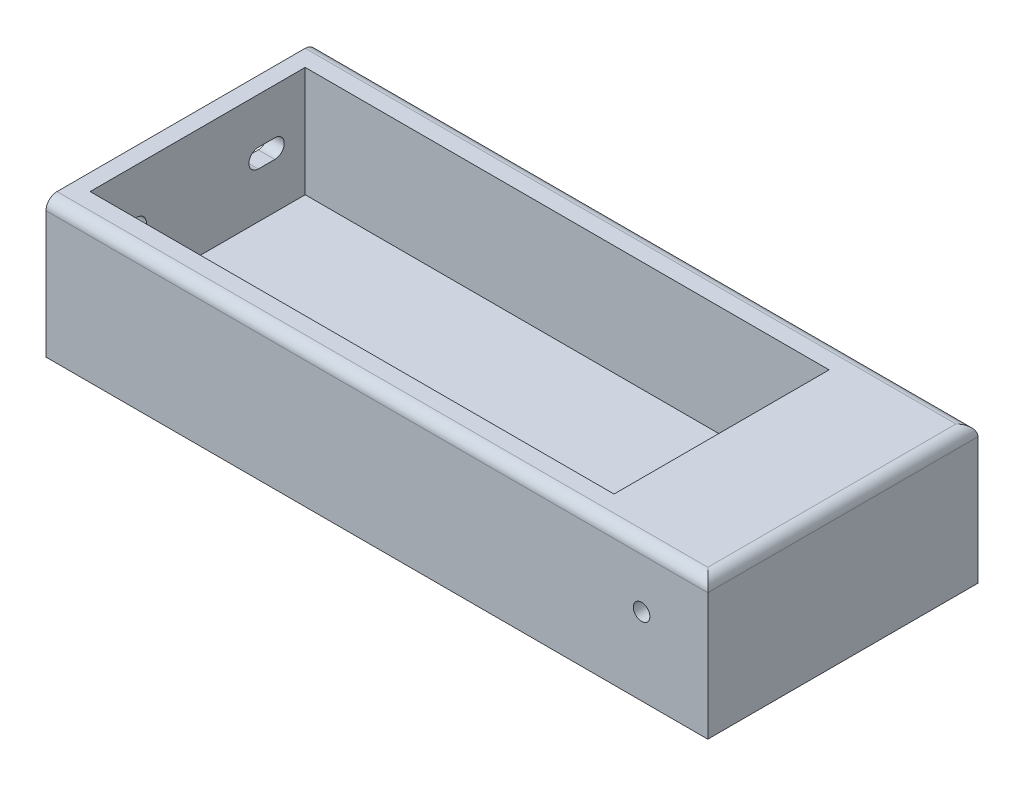
ISO-10303-21;
HEADER;
FILE_DESCRIPTION(('STEP AP214'),'2;1');
FILE_NAME('part.step','',(''),(''),'','','');
FILE_SCHEMA(('AUTOMOTIVE_DESIGN { 1 0 10303 214 1 1 1 1 }'));
ENDSEC;
DATA;
#1=APPLICATION_CONTEXT('core data for automotive mechanical design processes');
#2=APPLICATION_PROTOCOL_DEFINITION('international standard','automotive_design',2000,#1);
#3=PRODUCT_CONTEXT('',#1,'mechanical');
#4=PRODUCT('Part','Part','',(#3));
#5=PRODUCT_RELATED_PRODUCT_CATEGORY('part','',(#4));
#6=PRODUCT_DEFINITION_FORMATION('','',#4);
#7=PRODUCT_DEFINITION_CONTEXT('part definition',#1,'design');
#8=PRODUCT_DEFINITION('design','',#6,#7);
#9=PRODUCT_DEFINITION_SHAPE('','',#8);
#10=(LENGTH_UNIT() NAMED_UNIT(*) SI_UNIT(.MILLI.,.METRE.));
#11=(NAMED_UNIT(*) PLANE_ANGLE_UNIT() SI_UNIT($,.RADIAN.));
#12=(NAMED_UNIT(*) SI_UNIT($,.STERADIAN.) SOLID_ANGLE_UNIT());
#13=UNCERTAINTY_MEASURE_WITH_UNIT(LENGTH_MEASURE(1.E-05),#10,'distance_accuracy_value','');
#14=(GEOMETRIC_REPRESENTATION_CONTEXT(3) GLOBAL_UNCERTAINTY_ASSIGNED_CONTEXT((#13)) GLOBAL_UNIT_ASSIGNED_CONTEXT((#10,
#11,#12)) REPRESENTATION_CONTEXT('',''));
#15=CARTESIAN_POINT('',(0.,0.,0.));
#16=DIRECTION('',(0.,0.,1.));
#17=DIRECTION('',(1.,0.,0.));
#18=AXIS2_PLACEMENT_3D('',#15,#16,#17);
#19=CARTESIAN_POINT('',(60.0000000000003,12.5,-24.5000000000001));
#20=DIRECTION('',(-1.,0.,0.));
#21=DIRECTION('',(0.,0.,1.));
#22=AXIS2_PLACEMENT_3D('',#19,#20,#21);
#23=PLANE('',#22);
#24=DIRECTION('',(0.,-1.,0.));
#25=VECTOR('',#24,1.);
#26=CARTESIAN_POINT('',(60.0000000000003,12.5,-24.5000000000001));
#27=LINE('',#26,#25);
#28=CARTESIAN_POINT('',(60.0000000000003,10.5,-24.5000000000001));
#29=VERTEX_POINT('',#28);
#30=CARTESIAN_POINT('',(60.0000000000003,-12.5,-24.5000000000001));
#31=VERTEX_POINT('',#30);
#32=EDGE_CURVE('E484',#29,#31,#27,.T.);
#33=ORIENTED_EDGE('',*,*,#32,.F.);
#34=DIRECTION('',(0.,0.,-1.));
#35=VECTOR('',#34,1.);
#36=CARTESIAN_POINT('',(60.0000000000001,10.5,24.4999999999999));
#37=LINE('',#36,#35);
#38=CARTESIAN_POINT('',(60.0000000000001,10.5,24.4999999999999));
#39=VERTEX_POINT('',#38);
#40=EDGE_CURVE('E497',#29,#39,#37,.F.);
#41=ORIENTED_EDGE('',*,*,#40,.T.);
#42=DIRECTION('',(0.,-1.,0.));
#43=VECTOR('',#42,1.);
#44=CARTESIAN_POINT('',(60.0000000000001,12.5,24.4999999999999));
#45=LINE('',#44,#43);
#46=CARTESIAN_POINT('',(60.0000000000001,-12.5,24.4999999999999));
#47=VERTEX_POINT('',#46);
#48=EDGE_CURVE('E460',#39,#47,#45,.T.);
#49=ORIENTED_EDGE('',*,*,#48,.T.);
#50=DIRECTION('',(0.,0.,-1.));
#51=VECTOR('',#50,1.);
#52=CARTESIAN_POINT('',(60.0000000000003,-12.5,-24.5000000000001));
#53=LINE('',#52,#51);
#54=EDGE_CURVE('E446',#47,#31,#53,.T.);
#55=ORIENTED_EDGE('',*,*,#54,.T.);
#56=EDGE_LOOP('',(#33,#41,#49,#55));
#57=FACE_BOUND('',#56,.T.);
#58=ADVANCED_FACE('F194',(#57),#23,.F.);
#59=CARTESIAN_POINT('',(-59.9999999999998,12.5,-24.5000000000001));
#60=DIRECTION('',(0.,0.,1.));
#61=DIRECTION('',(1.,0.,0.));
#62=AXIS2_PLACEMENT_3D('',#59,#60,#61);
#63=PLANE('',#62);
#64=CARTESIAN_POINT('',(48.0000000000003,1.5,-24.5000000000001));
#65=DIRECTION('',(0.,0.,-1.));
#66=DIRECTION('',(-1.,0.,0.));
#67=AXIS2_PLACEMENT_3D('',#64,#65,#66);
#68=CIRCLE('',#67,1.5);
#69=CARTESIAN_POINT('',(46.5000000000003,1.5,-24.5000000000001));
#70=VERTEX_POINT('',#69);
#71=EDGE_CURVE('E813',#70,#70,#68,.T.);
#72=ORIENTED_EDGE('',*,*,#71,.F.);
#73=EDGE_LOOP('',(#72));
#74=FACE_BOUND('',#73,.T.);
#75=DIRECTION('',(0.,-1.,0.));
#76=VECTOR('',#75,1.);
#77=CARTESIAN_POINT('',(-59.9999999999998,12.5,-24.5000000000001));
#78=LINE('',#77,#76);
#79=CARTESIAN_POINT('',(-59.9999999999998,10.5,-24.5000000000001));
#80=VERTEX_POINT('',#79);
#81=CARTESIAN_POINT('',(-59.9999999999998,-12.5,-24.5000000000001));
#82=VERTEX_POINT('',#81);
#83=EDGE_CURVE('E481',#80,#82,#78,.T.);
#84=ORIENTED_EDGE('',*,*,#83,.F.);
#85=DIRECTION('',(-1.,0.,0.));
#86=VECTOR('',#85,1.);
#87=CARTESIAN_POINT('',(60.0000000000003,10.5,-24.5000000000001));
#88=LINE('',#87,#86);
#89=EDGE_CURVE('E13',#80,#29,#88,.F.);
#90=ORIENTED_EDGE('',*,*,#89,.T.);
#91=ORIENTED_EDGE('',*,*,#32,.T.);
#92=DIRECTION('',(-1.,0.,0.));
#93=VECTOR('',#92,1.);
#94=CARTESIAN_POINT('',(-59.9999999999998,-12.5,-24.5000000000001));
#95=LINE('',#94,#93);
#96=EDGE_CURVE('E465',#31,#82,#95,.T.);
#97=ORIENTED_EDGE('',*,*,#96,.T.);
#98=EDGE_LOOP('',(#84,#90,#91,#97));
#99=FACE_BOUND('',#98,.T.);
#100=ADVANCED_FACE('F542',(#74,#99),#63,.F.);
#101=CARTESIAN_POINT('',(-59.9999999999998,12.5,-24.5000000000001));
#102=DIRECTION('',(1.,0.,0.));
#103=DIRECTION('',(0.,0.,-1.));
#104=AXIS2_PLACEMENT_3D('',#101,#102,#103);
#105=PLANE('',#104);
#106=CARTESIAN_POINT('',(-59.9999999999998,2.5,10.9999999999999));
#107=DIRECTION('',(1.,0.,0.));
#108=DIRECTION('',(0.,0.,-1.));
#109=AXIS2_PLACEMENT_3D('',#106,#107,#108);
#110=CIRCLE('',#109,1.7);
#111=CARTESIAN_POINT('',(-59.9999999999998,0.800000000000002,10.9999999999999));
#112=VERTEX_POINT('',#111);
#113=CARTESIAN_POINT('',(-59.9999999999998,4.2,10.9999999999999));
#114=VERTEX_POINT('',#113);
#115=EDGE_CURVE('E217',#112,#114,#110,.T.);
#116=ORIENTED_EDGE('',*,*,#115,.T.);
#117=DIRECTION('',(0.,0.,1.));
#118=VECTOR('',#117,1.);
#119=CARTESIAN_POINT('',(-59.9999999999998,4.2,10.9999999999999));
#120=LINE('',#119,#118);
#121=CARTESIAN_POINT('',(-59.9999999999998,4.2,13.9999999999999));
#122=VERTEX_POINT('',#121);
#123=EDGE_CURVE('E326',#114,#122,#120,.T.);
#124=ORIENTED_EDGE('',*,*,#123,.T.);
#125=CARTESIAN_POINT('',(-59.9999999999998,2.5,13.9999999999999));
#126=DIRECTION('',(1.,0.,0.));
#127=DIRECTION('',(0.,0.,-1.));
#128=AXIS2_PLACEMENT_3D('',#125,#126,#127);
#129=CIRCLE('',#128,1.7);
#130=CARTESIAN_POINT('',(-59.9999999999998,0.800000000000002,13.9999999999999));
#131=VERTEX_POINT('',#130);
#132=EDGE_CURVE('E360',#122,#131,#129,.T.);
#133=ORIENTED_EDGE('',*,*,#132,.T.);
#134=DIRECTION('',(0.,0.,1.));
#135=VECTOR('',#134,1.);
#136=CARTESIAN_POINT('',(-59.9999999999998,0.800000000000002,10.9999999999999));
#137=LINE('',#136,#135);
#138=EDGE_CURVE('E333',#112,#131,#137,.T.);
#139=ORIENTED_EDGE('',*,*,#138,.F.);
#140=EDGE_LOOP('',(#116,#124,#133,#139));
#141=FACE_BOUND('',#140,.T.);
#142=DIRECTION('',(0.,0.,1.));
#143=VECTOR('',#142,1.);
#144=CARTESIAN_POINT('',(-59.9999999999998,4.2,-14.0000000000001));
#145=LINE('',#144,#143);
#146=CARTESIAN_POINT('',(-59.9999999999998,4.2,-14.0000000000001));
#147=VERTEX_POINT('',#146);
#148=CARTESIAN_POINT('',(-59.9999999999998,4.2,-11.0000000000001));
#149=VERTEX_POINT('',#148);
#150=EDGE_CURVE('E369',#147,#149,#145,.T.);
#151=ORIENTED_EDGE('',*,*,#150,.T.);
#152=CARTESIAN_POINT('',(-59.9999999999998,2.5,-11.0000000000001));
#153=DIRECTION('',(1.,0.,0.));
#154=DIRECTION('',(0.,0.,-1.));
#155=AXIS2_PLACEMENT_3D('',#152,#153,#154);
#156=CIRCLE('',#155,1.7);
#157=CARTESIAN_POINT('',(-59.9999999999998,0.800000000000002,-11.0000000000001));
#158=VERTEX_POINT('',#157);
#159=EDGE_CURVE('E402',#149,#158,#156,.T.);
#160=ORIENTED_EDGE('',*,*,#159,.T.);
#161=DIRECTION('',(0.,0.,1.));
#162=VECTOR('',#161,1.);
#163=CARTESIAN_POINT('',(-59.9999999999998,0.800000000000002,-14.0000000000001));
#164=LINE('',#163,#162);
#165=CARTESIAN_POINT('',(-59.9999999999998,0.800000000000002,-14.0000000000001));
#166=VERTEX_POINT('',#165);
#167=EDGE_CURVE('E373',#166,#158,#164,.T.);
#168=ORIENTED_EDGE('',*,*,#167,.F.);
#169=CARTESIAN_POINT('',(-59.9999999999998,2.5,-14.0000000000001));
#170=DIRECTION('',(1.,0.,0.));
#171=DIRECTION('',(0.,0.,-1.));
#172=AXIS2_PLACEMENT_3D('',#169,#170,#171);
#173=CIRCLE('',#172,1.7);
#174=EDGE_CURVE('E388',#166,#147,#173,.T.);
#175=ORIENTED_EDGE('',*,*,#174,.T.);
#176=EDGE_LOOP('',(#151,#160,#168,#175));
#177=FACE_BOUND('',#176,.T.);
#178=DIRECTION('',(0.,-1.,0.));
#179=VECTOR('',#178,1.);
#180=CARTESIAN_POINT('',(-59.9999999999998,12.5,24.4999999999999));
#181=LINE('',#180,#179);
#182=CARTESIAN_POINT('',(-59.9999999999998,10.5,24.4999999999999));
#183=VERTEX_POINT('',#182);
#184=CARTESIAN_POINT('',(-59.9999999999998,-12.5,24.4999999999999));
#185=VERTEX_POINT('',#184);
#186=EDGE_CURVE('E478',#183,#185,#181,.T.);
#187=ORIENTED_EDGE('',*,*,#186,.F.);
#188=CARTESIAN_POINT('',(-59.9999999999998,10.5,22.4999999999999));
#189=DIRECTION('',(1.,0.,0.));
#190=DIRECTION('',(0.,0.,-1.));
#191=AXIS2_PLACEMENT_3D('',#188,#189,#190);
#192=CIRCLE('',#191,2.);
#193=CARTESIAN_POINT('',(-59.9999999999998,12.5,22.4999999999999));
#194=VERTEX_POINT('',#193);
#195=EDGE_CURVE('E209',#183,#194,#192,.F.);
#196=ORIENTED_EDGE('',*,*,#195,.T.);
#197=DIRECTION('',(0.,0.,1.));
#198=VECTOR('',#197,1.);
#199=CARTESIAN_POINT('',(-59.9999999999998,12.5,-24.5000000000001));
#200=LINE('',#199,#198);
#201=CARTESIAN_POINT('',(-59.9999999999998,12.5,-22.5000000000001));
#202=VERTEX_POINT('',#201);
#203=EDGE_CURVE('E456',#202,#194,#200,.T.);
#204=ORIENTED_EDGE('',*,*,#203,.F.);
#205=CARTESIAN_POINT('',(-59.9999999999998,10.5,-22.5000000000001));
#206=DIRECTION('',(1.,0.,0.));
#207=DIRECTION('',(0.,0.,-1.));
#208=AXIS2_PLACEMENT_3D('',#205,#206,#207);
#209=CIRCLE('',#208,2.);
#210=EDGE_CURVE('E503',#202,#80,#209,.F.);
#211=ORIENTED_EDGE('',*,*,#210,.T.);
#212=ORIENTED_EDGE('',*,*,#83,.T.);
#213=DIRECTION('',(0.,0.,1.));
#214=VECTOR('',#213,1.);
#215=CARTESIAN_POINT('',(-59.9999999999998,-12.5,-24.5000000000001));
#216=LINE('',#215,#214);
#217=EDGE_CURVE('E469',#82,#185,#216,.T.);
#218=ORIENTED_EDGE('',*,*,#217,.T.);
#219=EDGE_LOOP('',(#187,#196,#204,#211,#212,#218));
#220=FACE_BOUND('',#219,.T.);
#221=ADVANCED_FACE('F344',(#141,#177,#220),#105,.F.);
#222=CARTESIAN_POINT('',(-59.9999999999998,12.5,24.4999999999999));
#223=DIRECTION('',(0.,0.,-1.));
#224=DIRECTION('',(-1.,0.,0.));
#225=AXIS2_PLACEMENT_3D('',#222,#223,#224);
#226=PLANE('',#225);
#227=CARTESIAN_POINT('',(48.0000000000003,1.5,24.4999999999999));
#228=DIRECTION('',(0.,0.,-1.));
#229=DIRECTION('',(-1.,0.,0.));
#230=AXIS2_PLACEMENT_3D('',#227,#228,#229);
#231=CIRCLE('',#230,1.5);
#232=CARTESIAN_POINT('',(46.5000000000003,1.5,24.4999999999999));
#233=VERTEX_POINT('',#232);
#234=EDGE_CURVE('E518',#233,#233,#231,.T.);
#235=ORIENTED_EDGE('',*,*,#234,.T.);
#236=EDGE_LOOP('',(#235));
#237=FACE_BOUND('',#236,.T.);
#238=ORIENTED_EDGE('',*,*,#48,.F.);
#239=DIRECTION('',(1.,0.,0.));
#240=VECTOR('',#239,1.);
#241=CARTESIAN_POINT('',(-59.9999999999998,10.5,24.4999999999999));
#242=LINE('',#241,#240);
#243=EDGE_CURVE('E500',#39,#183,#242,.F.);
#244=ORIENTED_EDGE('',*,*,#243,.T.);
#245=ORIENTED_EDGE('',*,*,#186,.T.);
#246=DIRECTION('',(1.,0.,0.));
#247=VECTOR('',#246,1.);
#248=CARTESIAN_POINT('',(-59.9999999999998,-12.5,24.4999999999999));
#249=LINE('',#248,#247);
#250=EDGE_CURVE('E461',#185,#47,#249,.T.);
#251=ORIENTED_EDGE('',*,*,#250,.T.);
#252=EDGE_LOOP('',(#238,#244,#245,#251));
#253=FACE_BOUND('',#252,.T.);
#254=ADVANCED_FACE('F591',(#237,#253),#226,.F.);
#255=CARTESIAN_POINT('',(0.,12.5,0.));
#256=DIRECTION('',(0.,1.,0.));
#257=DIRECTION('',(0.,0.,1.));
#258=AXIS2_PLACEMENT_3D('',#255,#256,#257);
#259=PLANE('',#258);
#260=DIRECTION('',(0.,0.,1.));
#261=VECTOR('',#260,1.);
#262=CARTESIAN_POINT('',(-56.9999999999998,12.5,-19.5000000000001));
#263=LINE('',#262,#261);
#264=CARTESIAN_POINT('',(-56.9999999999998,12.5,-19.5000000000001));
#265=VERTEX_POINT('',#264);
#266=CARTESIAN_POINT('',(-56.9999999999998,12.5,19.4999999999999));
#267=VERTEX_POINT('',#266);
#268=EDGE_CURVE('E428',#265,#267,#263,.T.);
#269=ORIENTED_EDGE('',*,*,#268,.F.);
#270=DIRECTION('',(-1.,0.,0.));
#271=VECTOR('',#270,1.);
#272=CARTESIAN_POINT('',(-56.9999999999998,12.5,-19.5000000000001));
#273=LINE('',#272,#271);
#274=CARTESIAN_POINT('',(38.0000000000002,12.5,-19.5000000000001));
#275=VERTEX_POINT('',#274);
#276=EDGE_CURVE('E415',#275,#265,#273,.T.);
#277=ORIENTED_EDGE('',*,*,#276,.F.);
#278=DIRECTION('',(0.,0.,-1.));
#279=VECTOR('',#278,1.);
#280=CARTESIAN_POINT('',(38.0000000000002,12.5,-19.5000000000001));
#281=LINE('',#280,#279);
#282=CARTESIAN_POINT('',(38.0000000000002,12.5,19.4999999999999));
#283=VERTEX_POINT('',#282);
#284=EDGE_CURVE('E436',#283,#275,#281,.T.);
#285=ORIENTED_EDGE('',*,*,#284,.F.);
#286=DIRECTION('',(1.,0.,0.));
#287=VECTOR('',#286,1.);
#288=CARTESIAN_POINT('',(-56.9999999999998,12.5,19.4999999999999));
#289=LINE('',#288,#287);
#290=EDGE_CURVE('E431',#267,#283,#289,.T.);
#291=ORIENTED_EDGE('',*,*,#290,.F.);
#292=EDGE_LOOP('',(#269,#277,#285,#291));
#293=FACE_BOUND('',#292,.T.);
#294=ORIENTED_EDGE('',*,*,#203,.T.);
#295=DIRECTION('',(1.,0.,0.));
#296=VECTOR('',#295,1.);
#297=CARTESIAN_POINT('',(60.0000000000001,12.5,22.4999999999999));
#298=LINE('',#297,#296);
#299=CARTESIAN_POINT('',(58.0000000000001,12.5,22.4999999999999));
#300=VERTEX_POINT('',#299);
#301=EDGE_CURVE('E494',#194,#300,#298,.T.);
#302=ORIENTED_EDGE('',*,*,#301,.T.);
#303=DIRECTION('',(0.,0.,-1.));
#304=VECTOR('',#303,1.);
#305=CARTESIAN_POINT('',(58.0000000000003,12.5,-24.5000000000001));
#306=LINE('',#305,#304);
#307=CARTESIAN_POINT('',(58.0000000000003,12.5,-22.5000000000001));
#308=VERTEX_POINT('',#307);
#309=EDGE_CURVE('E490',#300,#308,#306,.T.);
#310=ORIENTED_EDGE('',*,*,#309,.T.);
#311=DIRECTION('',(-1.,0.,0.));
#312=VECTOR('',#311,1.);
#313=CARTESIAN_POINT('',(-59.9999999999998,12.5,-22.5000000000001));
#314=LINE('',#313,#312);
#315=EDGE_CURVE('E487',#308,#202,#314,.T.);
#316=ORIENTED_EDGE('',*,*,#315,.T.);
#317=EDGE_LOOP('',(#294,#302,#310,#316));
#318=FACE_BOUND('',#317,.T.);
#319=ADVANCED_FACE('F588',(#293,#318),#259,.T.);
#320=CARTESIAN_POINT('',(0.,-12.5,0.));
#321=DIRECTION('',(0.,1.,0.));
#322=DIRECTION('',(0.,0.,1.));
#323=AXIS2_PLACEMENT_3D('',#320,#321,#322);
#324=PLANE('',#323);
#325=CARTESIAN_POINT('',(48.,-12.5,0.));
#326=DIRECTION('',(0.,-1.,0.));
#327=DIRECTION('',(0.,0.,-1.));
#328=AXIS2_PLACEMENT_3D('',#325,#326,#327);
#329=CIRCLE('',#328,5.5);
#330=CARTESIAN_POINT('',(48.,-12.5,-5.5));
#331=VERTEX_POINT('',#330);
#332=EDGE_CURVE('E807',#331,#331,#329,.T.);
#333=ORIENTED_EDGE('',*,*,#332,.F.);
#334=EDGE_LOOP('',(#333));
#335=FACE_BOUND('',#334,.T.);
#336=ORIENTED_EDGE('',*,*,#54,.F.);
#337=ORIENTED_EDGE('',*,*,#250,.F.);
#338=ORIENTED_EDGE('',*,*,#217,.F.);
#339=ORIENTED_EDGE('',*,*,#96,.F.);
#340=EDGE_LOOP('',(#336,#337,#338,#339));
#341=FACE_BOUND('',#340,.T.);
#342=ADVANCED_FACE('F580',(#335,#341),#324,.F.);
#343=CARTESIAN_POINT('',(-56.9999999999998,-7.5,-19.5000000000001));
#344=DIRECTION('',(-1.,0.,0.));
#345=DIRECTION('',(0.,0.,1.));
#346=AXIS2_PLACEMENT_3D('',#343,#344,#345);
#347=PLANE('',#346);
#348=DIRECTION('',(0.,0.,1.));
#349=VECTOR('',#348,1.);
#350=CARTESIAN_POINT('',(-56.9999999999998,0.800000000000002,10.9999999999999));
#351=LINE('',#350,#349);
#352=CARTESIAN_POINT('',(-56.9999999999998,0.800000000000051,10.9999999999999));
#353=VERTEX_POINT('',#352);
#354=CARTESIAN_POINT('',(-56.9999999999998,0.800000000000002,13.9999999999999));
#355=VERTEX_POINT('',#354);
#356=EDGE_CURVE('E341',#353,#355,#351,.T.);
#357=ORIENTED_EDGE('',*,*,#356,.T.);
#358=CARTESIAN_POINT('',(-56.9999999999998,2.5,13.9999999999999));
#359=DIRECTION('',(1.,0.,0.));
#360=DIRECTION('',(0.,0.,-1.));
#361=AXIS2_PLACEMENT_3D('',#358,#359,#360);
#362=CIRCLE('',#361,1.7);
#363=CARTESIAN_POINT('',(-56.9999999999998,4.20000000000004,13.9999999999999));
#364=VERTEX_POINT('',#363);
#365=EDGE_CURVE('E356',#364,#355,#362,.T.);
#366=ORIENTED_EDGE('',*,*,#365,.F.);
#367=DIRECTION('',(0.,0.,1.));
#368=VECTOR('',#367,1.);
#369=CARTESIAN_POINT('',(-56.9999999999998,4.20000000000004,10.9999999999999));
#370=LINE('',#369,#368);
#371=CARTESIAN_POINT('',(-56.9999999999998,4.2,10.9999999999999));
#372=VERTEX_POINT('',#371);
#373=EDGE_CURVE('E334',#372,#364,#370,.T.);
#374=ORIENTED_EDGE('',*,*,#373,.F.);
#375=CARTESIAN_POINT('',(-56.9999999999998,2.5,10.9999999999999));
#376=DIRECTION('',(1.,0.,0.));
#377=DIRECTION('',(0.,0.,-1.));
#378=AXIS2_PLACEMENT_3D('',#375,#376,#377);
#379=CIRCLE('',#378,1.7);
#380=EDGE_CURVE('E338',#353,#372,#379,.T.);
#381=ORIENTED_EDGE('',*,*,#380,.F.);
#382=EDGE_LOOP('',(#357,#366,#374,#381));
#383=FACE_BOUND('',#382,.T.);
#384=CARTESIAN_POINT('',(-56.9999999999998,2.5,-14.0000000000001));
#385=DIRECTION('',(1.,0.,0.));
#386=DIRECTION('',(0.,0.,-1.));
#387=AXIS2_PLACEMENT_3D('',#384,#385,#386);
#388=CIRCLE('',#387,1.7);
#389=CARTESIAN_POINT('',(-56.9999999999998,0.800000000000051,-14.0000000000001));
#390=VERTEX_POINT('',#389);
#391=CARTESIAN_POINT('',(-56.9999999999998,4.2,-14.0000000000001));
#392=VERTEX_POINT('',#391);
#393=EDGE_CURVE('E384',#390,#392,#388,.T.);
#394=ORIENTED_EDGE('',*,*,#393,.F.);
#395=DIRECTION('',(0.,0.,1.));
#396=VECTOR('',#395,1.);
#397=CARTESIAN_POINT('',(-56.9999999999998,0.800000000000002,-14.0000000000001));
#398=LINE('',#397,#396);
#399=CARTESIAN_POINT('',(-56.9999999999998,0.800000000000002,-11.0000000000001));
#400=VERTEX_POINT('',#399);
#401=EDGE_CURVE('E376',#390,#400,#398,.T.);
#402=ORIENTED_EDGE('',*,*,#401,.T.);
#403=CARTESIAN_POINT('',(-56.9999999999998,2.5,-11.0000000000001));
#404=DIRECTION('',(1.,0.,0.));
#405=DIRECTION('',(0.,0.,-1.));
#406=AXIS2_PLACEMENT_3D('',#403,#404,#405);
#407=CIRCLE('',#406,1.7);
#408=CARTESIAN_POINT('',(-56.9999999999998,4.20000000000004,-11.0000000000001));
#409=VERTEX_POINT('',#408);
#410=EDGE_CURVE('E398',#409,#400,#407,.T.);
#411=ORIENTED_EDGE('',*,*,#410,.F.);
#412=DIRECTION('',(0.,0.,1.));
#413=VECTOR('',#412,1.);
#414=CARTESIAN_POINT('',(-56.9999999999998,4.20000000000004,-14.0000000000001));
#415=LINE('',#414,#413);
#416=EDGE_CURVE('E366',#392,#409,#415,.T.);
#417=ORIENTED_EDGE('',*,*,#416,.F.);
#418=EDGE_LOOP('',(#394,#402,#411,#417));
#419=FACE_BOUND('',#418,.T.);
#420=ORIENTED_EDGE('',*,*,#268,.T.);
#421=DIRECTION('',(0.,1.,0.));
#422=VECTOR('',#421,1.);
#423=CARTESIAN_POINT('',(-56.9999999999998,-7.5,19.4999999999999));
#424=LINE('',#423,#422);
#425=CARTESIAN_POINT('',(-56.9999999999998,-7.5,19.4999999999999));
#426=VERTEX_POINT('',#425);
#427=EDGE_CURVE('E427',#426,#267,#424,.T.);
#428=ORIENTED_EDGE('',*,*,#427,.F.);
#429=DIRECTION('',(0.,0.,1.));
#430=VECTOR('',#429,1.);
#431=CARTESIAN_POINT('',(-56.9999999999998,-7.5,-19.5000000000001));
#432=LINE('',#431,#430);
#433=CARTESIAN_POINT('',(-56.9999999999998,-7.5,-19.5000000000001));
#434=VERTEX_POINT('',#433);
#435=EDGE_CURVE('E410',#434,#426,#432,.T.);
#436=ORIENTED_EDGE('',*,*,#435,.F.);
#437=DIRECTION('',(0.,1.,0.));
#438=VECTOR('',#437,1.);
#439=CARTESIAN_POINT('',(-56.9999999999998,-7.5,-19.5000000000001));
#440=LINE('',#439,#438);
#441=EDGE_CURVE('E443',#434,#265,#440,.T.);
#442=ORIENTED_EDGE('',*,*,#441,.T.);
#443=EDGE_LOOP('',(#420,#428,#436,#442));
#444=FACE_BOUND('',#443,.T.);
#445=ADVANCED_FACE('F602',(#383,#419,#444),#347,.F.);
#446=CARTESIAN_POINT('',(-56.9999999999998,-7.5,-19.5000000000001));
#447=DIRECTION('',(0.,0.,-1.));
#448=DIRECTION('',(-1.,0.,0.));
#449=AXIS2_PLACEMENT_3D('',#446,#447,#448);
#450=PLANE('',#449);
#451=ORIENTED_EDGE('',*,*,#276,.T.);
#452=ORIENTED_EDGE('',*,*,#441,.F.);
#453=DIRECTION('',(-1.,0.,0.));
#454=VECTOR('',#453,1.);
#455=CARTESIAN_POINT('',(-56.9999999999998,-7.5,-19.5000000000001));
#456=LINE('',#455,#454);
#457=CARTESIAN_POINT('',(38.0000000000002,-7.5,-19.5000000000001));
#458=VERTEX_POINT('',#457);
#459=EDGE_CURVE('E423',#458,#434,#456,.T.);
#460=ORIENTED_EDGE('',*,*,#459,.F.);
#461=DIRECTION('',(0.,1.,0.));
#462=VECTOR('',#461,1.);
#463=CARTESIAN_POINT('',(38.0000000000002,-7.5,-19.5000000000001));
#464=LINE('',#463,#462);
#465=EDGE_CURVE('E447',#458,#275,#464,.T.);
#466=ORIENTED_EDGE('',*,*,#465,.T.);
#467=EDGE_LOOP('',(#451,#452,#460,#466));
#468=FACE_BOUND('',#467,.T.);
#469=ADVANCED_FACE('F607',(#468),#450,.F.);
#470=CARTESIAN_POINT('',(38.0000000000002,-7.5,-19.5000000000001));
#471=DIRECTION('',(1.,0.,0.));
#472=DIRECTION('',(0.,0.,-1.));
#473=AXIS2_PLACEMENT_3D('',#470,#471,#472);
#474=PLANE('',#473);
#475=ORIENTED_EDGE('',*,*,#284,.T.);
#476=ORIENTED_EDGE('',*,*,#465,.F.);
#477=DIRECTION('',(0.,0.,-1.));
#478=VECTOR('',#477,1.);
#479=CARTESIAN_POINT('',(38.0000000000002,-7.5,-19.5000000000001));
#480=LINE('',#479,#478);
#481=CARTESIAN_POINT('',(38.0000000000002,-7.5,19.4999999999999));
#482=VERTEX_POINT('',#481);
#483=EDGE_CURVE('E419',#482,#458,#480,.T.);
#484=ORIENTED_EDGE('',*,*,#483,.F.);
#485=DIRECTION('',(0.,1.,0.));
#486=VECTOR('',#485,1.);
#487=CARTESIAN_POINT('',(38.0000000000002,-7.5,19.4999999999999));
#488=LINE('',#487,#486);
#489=EDGE_CURVE('E450',#482,#283,#488,.T.);
#490=ORIENTED_EDGE('',*,*,#489,.T.);
#491=EDGE_LOOP('',(#475,#476,#484,#490));
#492=FACE_BOUND('',#491,.T.);
#493=ADVANCED_FACE('F612',(#492),#474,.F.);
#494=CARTESIAN_POINT('',(-56.9999999999998,-7.5,19.4999999999999));
#495=DIRECTION('',(0.,0.,1.));
#496=DIRECTION('',(1.,0.,0.));
#497=AXIS2_PLACEMENT_3D('',#494,#495,#496);
#498=PLANE('',#497);
#499=ORIENTED_EDGE('',*,*,#290,.T.);
#500=ORIENTED_EDGE('',*,*,#489,.F.);
#501=DIRECTION('',(1.,0.,0.));
#502=VECTOR('',#501,1.);
#503=CARTESIAN_POINT('',(-56.9999999999998,-7.5,19.4999999999999));
#504=LINE('',#503,#502);
#505=EDGE_CURVE('E414',#426,#482,#504,.T.);
#506=ORIENTED_EDGE('',*,*,#505,.F.);
#507=ORIENTED_EDGE('',*,*,#427,.T.);
#508=EDGE_LOOP('',(#499,#500,#506,#507));
#509=FACE_BOUND('',#508,.T.);
#510=ADVANCED_FACE('F609',(#509),#498,.F.);
#511=CARTESIAN_POINT('',(0.,-7.5,0.));
#512=DIRECTION('',(0.,1.,0.));
#513=DIRECTION('',(0.,0.,1.));
#514=AXIS2_PLACEMENT_3D('',#511,#512,#513);
#515=PLANE('',#514);
#516=ORIENTED_EDGE('',*,*,#435,.T.);
#517=ORIENTED_EDGE('',*,*,#505,.T.);
#518=ORIENTED_EDGE('',*,*,#483,.T.);
#519=ORIENTED_EDGE('',*,*,#459,.T.);
#520=EDGE_LOOP('',(#516,#517,#518,#519));
#521=FACE_BOUND('',#520,.T.);
#522=ADVANCED_FACE('F564',(#521),#515,.T.);
#523=CARTESIAN_POINT('',(0.,10.5,22.4999999999999));
#524=DIRECTION('',(-1.,0.,0.));
#525=DIRECTION('',(0.,0.,1.));
#526=AXIS2_PLACEMENT_3D('',#523,#524,#525);
#527=CYLINDRICAL_SURFACE('',#526,2.);
#528=ORIENTED_EDGE('',*,*,#195,.F.);
#529=ORIENTED_EDGE('',*,*,#243,.F.);
#530=CARTESIAN_POINT('',(58.0000000000001,10.5,22.4999999999999));
#531=DIRECTION('',(-0.707106781186549,0.,0.707106781186546));
#532=DIRECTION('',(-0.707106781186546,0.,-0.707106781186549));
#533=AXIS2_PLACEMENT_3D('',#530,#531,#532);
#534=ELLIPSE('',#533,2.82842712474618,2.);
#535=EDGE_CURVE('E432',#300,#39,#534,.F.);
#536=ORIENTED_EDGE('',*,*,#535,.F.);
#537=ORIENTED_EDGE('',*,*,#301,.F.);
#538=EDGE_LOOP('',(#528,#529,#536,#537));
#539=FACE_BOUND('',#538,.T.);
#540=ADVANCED_FACE('F196',(#539),#527,.T.);
#541=CARTESIAN_POINT('',(0.,10.5,-22.5000000000001));
#542=DIRECTION('',(1.,0.,0.));
#543=DIRECTION('',(0.,0.,-1.));
#544=AXIS2_PLACEMENT_3D('',#541,#542,#543);
#545=CYLINDRICAL_SURFACE('',#544,2.);
#546=ORIENTED_EDGE('',*,*,#210,.F.);
#547=ORIENTED_EDGE('',*,*,#315,.F.);
#548=CARTESIAN_POINT('',(58.0000000000003,10.5,-22.5000000000001));
#549=DIRECTION('',(0.707106781186546,0.,0.707106781186549));
#550=DIRECTION('',(0.707106781186549,0.,-0.707106781186546));
#551=AXIS2_PLACEMENT_3D('',#548,#549,#550);
#552=ELLIPSE('',#551,2.8284271247462,2.);
#553=EDGE_CURVE('E409',#29,#308,#552,.T.);
#554=ORIENTED_EDGE('',*,*,#553,.F.);
#555=ORIENTED_EDGE('',*,*,#89,.F.);
#556=EDGE_LOOP('',(#546,#547,#554,#555));
#557=FACE_BOUND('',#556,.T.);
#558=ADVANCED_FACE('F557',(#557),#545,.T.);
#559=CARTESIAN_POINT('',(58.0000000000002,10.5,2.62828307870446E-13));
#560=DIRECTION('',(0.,0.,1.));
#561=DIRECTION('',(1.,0.,0.));
#562=AXIS2_PLACEMENT_3D('',#559,#560,#561);
#563=CYLINDRICAL_SURFACE('',#562,2.);
#564=ORIENTED_EDGE('',*,*,#535,.T.);
#565=ORIENTED_EDGE('',*,*,#40,.F.);
#566=ORIENTED_EDGE('',*,*,#553,.T.);
#567=ORIENTED_EDGE('',*,*,#309,.F.);
#568=EDGE_LOOP('',(#564,#565,#566,#567));
#569=FACE_BOUND('',#568,.T.);
#570=ADVANCED_FACE('F554',(#569),#563,.T.);
#571=CARTESIAN_POINT('',(-56.9999999999998,2.5,-11.0000000000001));
#572=DIRECTION('',(1.,0.,0.));
#573=DIRECTION('',(0.,0.,-1.));
#574=AXIS2_PLACEMENT_3D('',#571,#572,#573);
#575=CYLINDRICAL_SURFACE('',#574,1.7);
#576=ORIENTED_EDGE('',*,*,#159,.F.);
#577=DIRECTION('',(-1.,0.,0.));
#578=VECTOR('',#577,1.);
#579=CARTESIAN_POINT('',(-59.9999999999998,4.2,-11.0000000000001));
#580=LINE('',#579,#578);
#581=EDGE_CURVE('E395',#409,#149,#580,.T.);
#582=ORIENTED_EDGE('',*,*,#581,.F.);
#583=ORIENTED_EDGE('',*,*,#410,.T.);
#584=DIRECTION('',(1.,0.,0.));
#585=VECTOR('',#584,1.);
#586=CARTESIAN_POINT('',(-56.9999999999998,0.800000000000002,-11.0000000000001));
#587=LINE('',#586,#585);
#588=EDGE_CURVE('E406',#158,#400,#587,.T.);
#589=ORIENTED_EDGE('',*,*,#588,.F.);
#590=EDGE_LOOP('',(#576,#582,#583,#589));
#591=FACE_BOUND('',#590,.T.);
#592=ADVANCED_FACE('F556',(#591),#575,.F.);
#593=CARTESIAN_POINT('',(-56.9999999999998,2.5,-14.0000000000001));
#594=DIRECTION('',(1.,0.,0.));
#595=DIRECTION('',(0.,0.,-1.));
#596=AXIS2_PLACEMENT_3D('',#593,#594,#595);
#597=CYLINDRICAL_SURFACE('',#596,1.7);
#598=ORIENTED_EDGE('',*,*,#393,.T.);
#599=DIRECTION('',(-1.,0.,0.));
#600=VECTOR('',#599,1.);
#601=CARTESIAN_POINT('',(-59.9999999999998,4.2,-14.0000000000001));
#602=LINE('',#601,#600);
#603=EDGE_CURVE('E380',#392,#147,#602,.T.);
#604=ORIENTED_EDGE('',*,*,#603,.T.);
#605=ORIENTED_EDGE('',*,*,#174,.F.);
#606=DIRECTION('',(1.,0.,0.));
#607=VECTOR('',#606,1.);
#608=CARTESIAN_POINT('',(-56.9999999999998,0.800000000000002,-14.0000000000001));
#609=LINE('',#608,#607);
#610=EDGE_CURVE('E392',#390,#166,#609,.F.);
#611=ORIENTED_EDGE('',*,*,#610,.F.);
#612=EDGE_LOOP('',(#598,#604,#605,#611));
#613=FACE_BOUND('',#612,.T.);
#614=ADVANCED_FACE('F624',(#613),#597,.F.);
#615=CARTESIAN_POINT('',(-56.9999999999998,0.800000000000002,-14.0000000000001));
#616=DIRECTION('',(0.,-1.,0.));
#617=DIRECTION('',(0.,0.,-1.));
#618=AXIS2_PLACEMENT_3D('',#615,#616,#617);
#619=PLANE('',#618);
#620=ORIENTED_EDGE('',*,*,#588,.T.);
#621=ORIENTED_EDGE('',*,*,#401,.F.);
#622=ORIENTED_EDGE('',*,*,#610,.T.);
#623=ORIENTED_EDGE('',*,*,#167,.T.);
#624=EDGE_LOOP('',(#620,#621,#622,#623));
#625=FACE_BOUND('',#624,.T.);
#626=ADVANCED_FACE('F628',(#625),#619,.F.);
#627=CARTESIAN_POINT('',(-59.9999999999998,4.2,-14.0000000000001));
#628=DIRECTION('',(0.,1.,0.));
#629=DIRECTION('',(-1.,0.,0.));
#630=AXIS2_PLACEMENT_3D('',#627,#628,#629);
#631=PLANE('',#630);
#632=ORIENTED_EDGE('',*,*,#581,.T.);
#633=ORIENTED_EDGE('',*,*,#150,.F.);
#634=ORIENTED_EDGE('',*,*,#603,.F.);
#635=ORIENTED_EDGE('',*,*,#416,.T.);
#636=EDGE_LOOP('',(#632,#633,#634,#635));
#637=FACE_BOUND('',#636,.T.);
#638=ADVANCED_FACE('F632',(#637),#631,.F.);
#639=CARTESIAN_POINT('',(-56.9999999999998,2.5,13.9999999999999));
#640=DIRECTION('',(1.,0.,0.));
#641=DIRECTION('',(0.,0.,-1.));
#642=AXIS2_PLACEMENT_3D('',#639,#640,#641);
#643=CYLINDRICAL_SURFACE('',#642,1.7);
#644=ORIENTED_EDGE('',*,*,#132,.F.);
#645=DIRECTION('',(-1.,0.,0.));
#646=VECTOR('',#645,1.);
#647=CARTESIAN_POINT('',(-59.9999999999998,4.2,13.9999999999999));
#648=LINE('',#647,#646);
#649=EDGE_CURVE('E329',#364,#122,#648,.T.);
#650=ORIENTED_EDGE('',*,*,#649,.F.);
#651=ORIENTED_EDGE('',*,*,#365,.T.);
#652=DIRECTION('',(1.,0.,0.));
#653=VECTOR('',#652,1.);
#654=CARTESIAN_POINT('',(-56.9999999999998,0.800000000000002,13.9999999999999));
#655=LINE('',#654,#653);
#656=EDGE_CURVE('E363',#131,#355,#655,.T.);
#657=ORIENTED_EDGE('',*,*,#656,.F.);
#658=EDGE_LOOP('',(#644,#650,#651,#657));
#659=FACE_BOUND('',#658,.T.);
#660=ADVANCED_FACE('F636',(#659),#643,.F.);
#661=CARTESIAN_POINT('',(-56.9999999999998,2.5,10.9999999999999));
#662=DIRECTION('',(1.,0.,0.));
#663=DIRECTION('',(0.,0.,-1.));
#664=AXIS2_PLACEMENT_3D('',#661,#662,#663);
#665=CYLINDRICAL_SURFACE('',#664,1.7);
#666=ORIENTED_EDGE('',*,*,#380,.T.);
#667=DIRECTION('',(-1.,0.,0.));
#668=VECTOR('',#667,1.);
#669=CARTESIAN_POINT('',(-59.9999999999998,4.2,10.9999999999999));
#670=LINE('',#669,#668);
#671=EDGE_CURVE('E224',#372,#114,#670,.T.);
#672=ORIENTED_EDGE('',*,*,#671,.T.);
#673=ORIENTED_EDGE('',*,*,#115,.F.);
#674=DIRECTION('',(1.,0.,0.));
#675=VECTOR('',#674,1.);
#676=CARTESIAN_POINT('',(-56.9999999999998,0.800000000000002,10.9999999999999));
#677=LINE('',#676,#675);
#678=EDGE_CURVE('E347',#353,#112,#677,.F.);
#679=ORIENTED_EDGE('',*,*,#678,.F.);
#680=EDGE_LOOP('',(#666,#672,#673,#679));
#681=FACE_BOUND('',#680,.T.);
#682=ADVANCED_FACE('F336',(#681),#665,.F.);
#683=CARTESIAN_POINT('',(-56.9999999999998,0.800000000000002,10.9999999999999));
#684=DIRECTION('',(0.,-1.,0.));
#685=DIRECTION('',(0.,0.,-1.));
#686=AXIS2_PLACEMENT_3D('',#683,#684,#685);
#687=PLANE('',#686);
#688=ORIENTED_EDGE('',*,*,#656,.T.);
#689=ORIENTED_EDGE('',*,*,#356,.F.);
#690=ORIENTED_EDGE('',*,*,#678,.T.);
#691=ORIENTED_EDGE('',*,*,#138,.T.);
#692=EDGE_LOOP('',(#688,#689,#690,#691));
#693=FACE_BOUND('',#692,.T.);
#694=ADVANCED_FACE('F643',(#693),#687,.F.);
#695=CARTESIAN_POINT('',(-59.9999999999998,4.2,10.9999999999999));
#696=DIRECTION('',(0.,1.,0.));
#697=DIRECTION('',(-1.,0.,0.));
#698=AXIS2_PLACEMENT_3D('',#695,#696,#697);
#699=PLANE('',#698);
#700=ORIENTED_EDGE('',*,*,#649,.T.);
#701=ORIENTED_EDGE('',*,*,#123,.F.);
#702=ORIENTED_EDGE('',*,*,#671,.F.);
#703=ORIENTED_EDGE('',*,*,#373,.T.);
#704=EDGE_LOOP('',(#700,#701,#702,#703));
#705=FACE_BOUND('',#704,.T.);
#706=ADVANCED_FACE('F327',(#705),#699,.F.);
#707=CARTESIAN_POINT('',(48.,7.5,0.));
#708=DIRECTION('',(0.,-1.,0.));
#709=DIRECTION('',(0.,0.,-1.));
#710=AXIS2_PLACEMENT_3D('',#707,#708,#709);
#711=CYLINDRICAL_SURFACE('',#710,5.5);
#712=CARTESIAN_POINT('',(48.,3.00000000000001,-5.5));
#713=CARTESIAN_POINT('',(48.0826209133322,2.99999818738899,-5.49999882717411));
#714=CARTESIAN_POINT('',(48.1652609788128,2.99315093641662,-5.4981200726076));
#715=CARTESIAN_POINT('',(48.3281559301578,2.96599416969688,-5.49080798085451));
#716=CARTESIAN_POINT('',(48.4084097279773,2.94567860837147,-5.48537304740498));
#717=CARTESIAN_POINT('',(48.5641576260555,2.89229826826167,-5.47154772174135));
#718=CARTESIAN_POINT('',(48.6396578669702,2.85925034733819,-5.46316123869394));
#719=CARTESIAN_POINT('',(48.7840444961598,2.7814070673377,-5.44431654412847));
#720=CARTESIAN_POINT('',(48.8529303632899,2.73661078364621,-5.43385816956516));
#721=CARTESIAN_POINT('',(48.9837969475734,2.63540016353289,-5.41171397042058));
#722=CARTESIAN_POINT('',(49.0455951291701,2.57875455914596,-5.40000641490428));
#723=CARTESIAN_POINT('',(49.1589429368249,2.45594736397028,-5.3768211293506));
#724=CARTESIAN_POINT('',(49.2104911782474,2.38978448959788,-5.36534343055201));
#725=CARTESIAN_POINT('',(49.3027779453951,2.24834875242073,-5.34369384163656));
#726=CARTESIAN_POINT('',(49.343304268376,2.17293285506393,-5.3335493005862));
#727=CARTESIAN_POINT('',(49.4110291636125,2.01603617180085,-5.31603507411912));
#728=CARTESIAN_POINT('',(49.4382303194687,1.93455656511174,-5.30866485085749));
#729=CARTESIAN_POINT('',(49.4778945644129,1.76987210498776,-5.29775847192735));
#730=CARTESIAN_POINT('',(49.4906896054326,1.68675305183831,-5.2941361228378));
#731=CARTESIAN_POINT('',(49.5022136440916,1.51947531699142,-5.29087829084076));
#732=CARTESIAN_POINT('',(49.5009454014091,1.43531684250021,-5.29124202573253));
#733=CARTESIAN_POINT('',(49.4846419178033,1.27095844903396,-5.29583824875448));
#734=CARTESIAN_POINT('',(49.4700107366897,1.19071476539799,-5.29995718313663));
#735=CARTESIAN_POINT('',(49.4280448387184,1.03386671397741,-5.31141755794051));
#736=CARTESIAN_POINT('',(49.4007090650468,0.957262649533916,-5.31875926644144));
#737=CARTESIAN_POINT('',(49.3337862982651,0.808826479452746,-5.33593618292317));
#738=CARTESIAN_POINT('',(49.2940595188299,0.737060798966576,-5.34579959764132));
#739=CARTESIAN_POINT('',(49.2035798802222,0.601073552590522,-5.36689368797783));
#740=CARTESIAN_POINT('',(49.1528247610625,0.536853537161437,-5.37812464363241));
#741=CARTESIAN_POINT('',(49.0396734668294,0.415474810193729,-5.40115894990596));
#742=CARTESIAN_POINT('',(48.9769386461677,0.358632550711216,-5.41296874297107));
#743=CARTESIAN_POINT('',(48.8426820117891,0.256209035022349,-5.43548647707971));
#744=CARTESIAN_POINT('',(48.771159819719,0.210628263950503,-5.44619437064286));
#745=CARTESIAN_POINT('',(48.6208539537401,0.131873327225177,-5.46537278121255));
#746=CARTESIAN_POINT('',(48.5420376374183,0.0987586614161415,-5.473832512873));
#747=CARTESIAN_POINT('',(48.3796726887149,0.046342027485916,-5.48748356142608));
#748=CARTESIAN_POINT('',(48.2961251443182,0.0270368975559064,-5.49267562644561));
#749=CARTESIAN_POINT('',(48.1293681704838,0.00328938220304622,-5.49909228776311));
#750=CARTESIAN_POINT('',(48.0462242977845,-0.00158299532035874,-5.50043163125371));
#751=CARTESIAN_POINT('',(47.8803066343625,0.00248274751340697,-5.49932301585136));
#752=CARTESIAN_POINT('',(47.797532804468,0.0114193696164559,-5.49687546782999));
#753=CARTESIAN_POINT('',(47.6362549022609,0.0424975027030826,-5.4885423926596));
#754=CARTESIAN_POINT('',(47.5577006757278,0.0643971927569388,-5.48271986472132));
#755=CARTESIAN_POINT('',(47.4053901325519,0.120497244640397,-5.46829923535649));
#756=CARTESIAN_POINT('',(47.3316343486955,0.154698969661181,-5.45970082634478));
#757=CARTESIAN_POINT('',(47.1893588388059,0.235216442285554,-5.44041573828281));
#758=CARTESIAN_POINT('',(47.1209753975879,0.281763487261414,-5.42969029549886));
#759=CARTESIAN_POINT('',(46.9928397798696,0.385361287545086,-5.40738988410042));
#760=CARTESIAN_POINT('',(46.9330893938228,0.442414216157343,-5.39581474001055));
#761=CARTESIAN_POINT('',(46.8220893965573,0.567414038034695,-5.37269401558503));
#762=CARTESIAN_POINT('',(46.7711437225282,0.635633382278753,-5.36115944983894));
#763=CARTESIAN_POINT('',(46.6814141779208,0.779898647219035,-5.33980026187822));
#764=CARTESIAN_POINT('',(46.6426298207411,0.855944254607301,-5.32997557125469));
#765=CARTESIAN_POINT('',(46.5786144168283,1.01334062824173,-5.31326248703824));
#766=CARTESIAN_POINT('',(46.5533064769305,1.09465826052499,-5.30635748202259));
#767=CARTESIAN_POINT('',(46.5167908277934,1.26061683802732,-5.29626814696195));
#768=CARTESIAN_POINT('',(46.5055793113688,1.34525687955343,-5.29308281231882));
#769=CARTESIAN_POINT('',(46.4978010442312,1.51233840381721,-5.29088009671769));
#770=CARTESIAN_POINT('',(46.50074466783,1.59475558872226,-5.29172336001593));
#771=CARTESIAN_POINT('',(46.5200516235605,1.75787064773474,-5.29715501736991));
#772=CARTESIAN_POINT('',(46.5364145797146,1.83856856994682,-5.30174330649896));
#773=CARTESIAN_POINT('',(46.581805915649,1.99530631577591,-5.31406316491802));
#774=CARTESIAN_POINT('',(46.6107260455089,2.07137975324155,-5.32176783125821));
#775=CARTESIAN_POINT('',(46.6803269545863,2.21765327681314,-5.33945189987966));
#776=CARTESIAN_POINT('',(46.7210096549556,2.28785240106498,-5.34943167369229));
#777=CARTESIAN_POINT('',(46.8144456901516,2.42271059769247,-5.37092379381815));
#778=CARTESIAN_POINT('',(46.8675309817789,2.48713370484295,-5.38247375845261));
#779=CARTESIAN_POINT('',(46.9836398880074,2.60631640679446,-5.40559990490856));
#780=CARTESIAN_POINT('',(47.0466659406121,2.6610736240052,-5.41717609247304));
#781=CARTESIAN_POINT('',(47.182592274314,2.76059461451929,-5.43936459177359));
#782=CARTESIAN_POINT('',(47.2556841337376,2.80510348086687,-5.44994907753807));
#783=CARTESIAN_POINT('',(47.4086001001608,2.88113243621139,-5.46865263780402));
#784=CARTESIAN_POINT('',(47.4884200475788,2.91266048055425,-5.47677322151197));
#785=CARTESIAN_POINT('',(47.6398998987818,2.95793950997895,-5.48864193995757));
#786=CARTESIAN_POINT('',(47.7109353597376,2.97367455124166,-5.49286947681091));
#787=CARTESIAN_POINT('',(47.8546423920586,2.99470502531881,-5.49854887164354));
#788=CARTESIAN_POINT('',(47.9273137844351,3.00000159465479,-5.5000010318002));
#789=CARTESIAN_POINT('',(48.,3.00000000000001,-5.5));
#790=B_SPLINE_CURVE_WITH_KNOTS('',3,(#712,#713,#714,#715,#716,#717,#718,#719,#720,#721,#722,
#723,#724,#725,#726,#727,#728,#729,#730,#731,#732,#733,#734,#735,#736,#737,#738,#739,#740,#741,
#742,#743,#744,#745,#746,#747,#748,#749,#750,#751,#752,#753,#754,#755,#756,#757,#758,#759,#760,
#761,#762,#763,#764,#765,#766,#767,#768,#769,#770,#771,#772,#773,#774,#775,#776,#777,#778,#779,
#780,#781,#782,#783,#784,#785,#786,#787,#788,#789),.UNSPECIFIED.,.T.,.F.,(4,2,2,2,2,2,2,2,2,2,2,
2,2,2,2,2,2,2,2,2,2,2,2,2,2,2,2,2,2,2,2,2,2,2,2,2,2,2,4),(0.,0.247596106854906,
0.495303428551302,0.742683902420577,0.990083851364713,1.24285878223179,1.49566783659324,
1.7530459365022,2.01037411390997,2.26164304860927,2.51286267696539,2.75672886674888,
3.00061534583719,3.24735926767929,3.49415380139122,3.74938528550775,4.00462776284424,
4.26107349736028,4.51746049766945,4.76612811343084,5.01476875105254,5.25891111200199,
5.50308053475839,5.75219469009683,6.00136043656004,6.2579007306487,6.51443075867913,
6.76948096455405,7.02446227124212,7.27068852228631,7.51690787489591,7.7610455565582,
8.0052231351759,8.25689011392095,8.50861891104977,8.76605872289061,9.02334052607439,
9.24118832093193,9.45901239561308),.UNSPECIFIED.);
#791=CARTESIAN_POINT('',(48.,3.00000000000001,-5.5));
#792=VERTEX_POINT('',#791);
#793=EDGE_CURVE('E198',#792,#792,#790,.T.);
#794=ORIENTED_EDGE('',*,*,#793,.T.);
#795=EDGE_LOOP('',(#794));
#796=FACE_BOUND('',#795,.T.);
#797=CARTESIAN_POINT('',(46.5000000000003,1.5,5.29150262212924));
#798=CARTESIAN_POINT('',(46.50000184303,1.41744354897225,5.29150397933248));
#799=CARTESIAN_POINT('',(46.5068387841331,1.33486789004449,5.29345578048329));
#800=CARTESIAN_POINT('',(46.533950894076,1.17210647469999,5.30102741905526));
#801=CARTESIAN_POINT('',(46.5542324030806,1.09192186450145,5.30664898703929));
#802=CARTESIAN_POINT('',(46.6075132537728,0.936320812038145,5.32087717395137));
#803=CARTESIAN_POINT('',(46.6404941530234,0.860897639095771,5.3294794623821));
#804=CARTESIAN_POINT('',(46.7181792597678,0.716641865763292,5.34869425130282));
#805=CARTESIAN_POINT('',(46.7628845303015,0.647809863762698,5.35930693404953));
#806=CARTESIAN_POINT('',(46.8640001414301,0.516889793208652,5.38165786345278));
#807=CARTESIAN_POINT('',(46.9206622578156,0.454999671621942,5.39341679089303));
#808=CARTESIAN_POINT('',(47.0435419727956,0.341472342274499,5.41655710292433));
#809=CARTESIAN_POINT('',(47.109760599499,0.289836239083979,5.42793844673194));
#810=CARTESIAN_POINT('',(47.2512524075853,0.197451373189515,5.4492727208685));
#811=CARTESIAN_POINT('',(47.3266591168822,0.156900278173546,5.45919841481046));
#812=CARTESIAN_POINT('',(47.4835362879438,0.0891271318171279,5.47626522558662));
#813=CARTESIAN_POINT('',(47.5650056753973,0.0619027254257754,5.48340683437024));
#814=CARTESIAN_POINT('',(47.7296285481523,0.0221989017194565,5.49395456075486));
#815=CARTESIAN_POINT('',(47.812695216581,0.00938255578526396,5.49744589597851));
#816=CARTESIAN_POINT('',(47.9798681285255,-0.00220230229795726,5.50059802264474));
#817=CARTESIAN_POINT('',(48.063974187791,-0.000973269544476937,5.50025948354));
#818=CARTESIAN_POINT('',(48.2284900607029,0.0152623986483947,5.49585206403332));
#819=CARTESIAN_POINT('',(48.3089388594299,0.0299048733192575,5.49188178563755));
#820=CARTESIAN_POINT('',(48.466191004897,0.0719623323455856,5.48077394096945));
#821=CARTESIAN_POINT('',(48.5429941388225,0.0993780613283394,5.47363619004789));
#822=CARTESIAN_POINT('',(48.6916932368952,0.166477135843018,5.45685088879512));
#823=CARTESIAN_POINT('',(48.7635307754919,0.2062834486877,5.44717834180863));
#824=CARTESIAN_POINT('',(48.8996292686613,0.296938894267401,5.42636287857445));
#825=CARTESIAN_POINT('',(48.9638886840778,0.347790264371343,5.41521966459723));
#826=CARTESIAN_POINT('',(49.0851807487591,0.461017995120858,5.39224620796901));
#827=CARTESIAN_POINT('',(49.141915532619,0.523711671940784,5.38040539296793));
#828=CARTESIAN_POINT('',(49.244140762822,0.657845215113348,5.35769198772819));
#829=CARTESIAN_POINT('',(49.2896304568182,0.729285666186392,5.34681946230355));
#830=CARTESIAN_POINT('',(49.3683150490667,0.879554394000367,5.32722971617587));
#831=CARTESIAN_POINT('',(49.4014254427273,0.958429005774215,5.31852743967162));
#832=CARTESIAN_POINT('',(49.4538164980909,1.12092260222912,5.30444735453966));
#833=CARTESIAN_POINT('',(49.4731007717829,1.20454034163283,5.2990686776927));
#834=CARTESIAN_POINT('',(49.4967712646015,1.37135218150999,5.29243075183369));
#835=CARTESIAN_POINT('',(49.501603290635,1.45447818676412,5.29104827888979));
#836=CARTESIAN_POINT('',(49.4974633261105,1.62035114354207,5.29222151202236));
#837=CARTESIAN_POINT('',(49.4884928818905,1.70309813648629,5.29477677694064));
#838=CARTESIAN_POINT('',(49.457396379618,1.86412243731137,5.30341820279282));
#839=CARTESIAN_POINT('',(49.4355415660941,1.94245642062979,5.30943150209333));
#840=CARTESIAN_POINT('',(49.3796033183856,2.09434600993062,5.32423951436496));
#841=CARTESIAN_POINT('',(49.3455182336674,2.16790096937769,5.33303460273282));
#842=CARTESIAN_POINT('',(49.2651924077906,2.31000070816699,5.35266567975264));
#843=CARTESIAN_POINT('',(49.2186916739519,2.37839257450498,5.36354371589175));
#844=CARTESIAN_POINT('',(49.1151744162273,2.50656606538514,5.38601762734155));
#845=CARTESIAN_POINT('',(49.0581558213745,2.56634599010013,5.39761364372332));
#846=CARTESIAN_POINT('',(48.9331533630015,2.6774663639506,5.42064365021147));
#847=CARTESIAN_POINT('',(48.8648888475199,2.7284950034342,5.43206199790192));
#848=CARTESIAN_POINT('',(48.7205055575072,2.81837063509098,5.45308956662171));
#849=CARTESIAN_POINT('',(48.6443872011091,2.85721827532782,5.46269888388571));
#850=CARTESIAN_POINT('',(48.4869923381522,2.92126706625792,5.47896373225221));
#851=CARTESIAN_POINT('',(48.4057600132457,2.9465708903005,5.48564141597943));
#852=CARTESIAN_POINT('',(48.2399858647231,2.98310695254508,5.4953882382012));
#853=CARTESIAN_POINT('',(48.1554448156241,2.99434246382693,5.49845821604059));
#854=CARTESIAN_POINT('',(47.9883602803183,3.00221012009058,5.50060207356917));
#855=CARTESIAN_POINT('',(47.9058395906951,2.99929867130671,5.49980084994582));
#856=CARTESIAN_POINT('',(47.7425086953631,2.98002022269001,5.4945768528746));
#857=CARTESIAN_POINT('',(47.6616984202292,2.96365377006973,5.49015422670855));
#858=CARTESIAN_POINT('',(47.5046579663034,2.91819262966053,5.47821112917836));
#859=CARTESIAN_POINT('',(47.4283979882053,2.88919430175976,5.47071413494116));
#860=CARTESIAN_POINT('',(47.2817826303777,2.8193783784649,5.45340440920126));
#861=CARTESIAN_POINT('',(47.2114281092682,2.77855906819339,5.44359134174259));
#862=CARTESIAN_POINT('',(47.0765113248048,2.6849452717183,5.42235787347665));
#863=CARTESIAN_POINT('',(47.0121629567874,2.63185092756335,5.41090053751392));
#864=CARTESIAN_POINT('',(46.8931350380694,2.51575786144977,5.38781343748965));
#865=CARTESIAN_POINT('',(46.8384580752582,2.45275649704873,5.37618362817698));
#866=CARTESIAN_POINT('',(46.7390603393814,2.31687247316908,5.35375507792817));
#867=CARTESIAN_POINT('',(46.6946012021209,2.2437937973192,5.34298201162851));
#868=CARTESIAN_POINT('',(46.61866193697,2.09091405485039,5.32385655741434));
#869=CARTESIAN_POINT('',(46.5871736932898,2.0111172294897,5.3155026568211));
#870=CARTESIAN_POINT('',(46.5419738884791,1.85973198074745,5.30326481572337));
#871=CARTESIAN_POINT('',(46.526271687771,1.78877153124848,5.29889066810927));
#872=CARTESIAN_POINT('',(46.5052845921063,1.64521220209729,5.29300915582121));
#873=CARTESIAN_POINT('',(46.4999983789411,1.5726135309487,5.29150142838462));
#874=CARTESIAN_POINT('',(46.5000000000003,1.5,5.29150262212924));
#875=B_SPLINE_CURVE_WITH_KNOTS('',3,(#797,#798,#799,#800,#801,#802,#803,#804,#805,#806,#807,
#808,#809,#810,#811,#812,#813,#814,#815,#816,#817,#818,#819,#820,#821,#822,#823,#824,#825,#826,
#827,#828,#829,#830,#831,#832,#833,#834,#835,#836,#837,#838,#839,#840,#841,#842,#843,#844,#845,
#846,#847,#848,#849,#850,#851,#852,#853,#854,#855,#856,#857,#858,#859,#860,#861,#862,#863,#864,
#865,#866,#867,#868,#869,#870,#871,#872,#873,#874),.UNSPECIFIED.,.T.,.F.,(4,2,2,2,2,2,2,2,2,2,2,
2,2,2,2,2,2,2,2,2,2,2,2,2,2,2,2,2,2,2,2,2,2,2,2,2,2,2,4),(0.,0.24740220139197,0.494921155336746,
0.742082002291418,0.989265266888861,1.24229327000827,1.49534851471805,1.75265882819586,
2.00992365416647,2.26103843021061,2.51210931268384,2.75655962385664,3.0010241872433,
3.24799669713118,3.49501928234235,3.74996416866224,4.00492610732059,4.26159801830627,
4.51820285087416,4.76680611540844,5.01538153009584,5.25890187447338,5.50245509545499,
5.7515742548923,6.00074251835821,6.25748556676549,6.51421495339718,6.76896951768224,
7.02366480072507,7.27019876040457,7.51672269408904,7.76139812559491,8.0061090701174,
8.25758505394758,8.50912822664457,8.76653181226184,9.02377409687476,9.2414072578133,
9.45901287413896),.UNSPECIFIED.);
#876=CARTESIAN_POINT('',(46.5000000000003,1.5,5.29150262212924));
#877=VERTEX_POINT('',#876);
#878=EDGE_CURVE('E512',#877,#877,#875,.T.);
#879=ORIENTED_EDGE('',*,*,#878,.T.);
#880=EDGE_LOOP('',(#879));
#881=FACE_BOUND('',#880,.T.);
#882=CARTESIAN_POINT('',(48.,7.5,0.));
#883=DIRECTION('',(0.,-1.,0.));
#884=DIRECTION('',(0.,0.,-1.));
#885=AXIS2_PLACEMENT_3D('',#882,#883,#884);
#886=CIRCLE('',#885,5.5);
#887=CARTESIAN_POINT('',(48.,7.5,-5.5));
#888=VERTEX_POINT('',#887);
#889=EDGE_CURVE('E806',#888,#888,#886,.T.);
#890=ORIENTED_EDGE('',*,*,#889,.F.);
#891=EDGE_LOOP('',(#890));
#892=FACE_BOUND('',#891,.T.);
#893=ORIENTED_EDGE('',*,*,#332,.T.);
#894=EDGE_LOOP('',(#893));
#895=FACE_BOUND('',#894,.T.);
#896=ADVANCED_FACE('F519',(#796,#881,#892,#895),#711,.F.);
#897=CARTESIAN_POINT('',(48.,7.5,0.));
#898=DIRECTION('',(0.,-1.,0.));
#899=DIRECTION('',(0.,0.,-1.));
#900=AXIS2_PLACEMENT_3D('',#897,#898,#899);
#901=PLANE('',#900);
#902=ORIENTED_EDGE('',*,*,#889,.T.);
#903=EDGE_LOOP('',(#902));
#904=FACE_BOUND('',#903,.T.);
#905=ADVANCED_FACE('F528',(#904),#901,.T.);
#906=CARTESIAN_POINT('',(48.0000000000003,1.5,24.4999999999999));
#907=DIRECTION('',(0.,0.,-1.));
#908=DIRECTION('',(-1.,0.,0.));
#909=AXIS2_PLACEMENT_3D('',#906,#907,#908);
#910=CYLINDRICAL_SURFACE('',#909,1.5);
#911=ORIENTED_EDGE('',*,*,#234,.F.);
#912=EDGE_LOOP('',(#911));
#913=FACE_BOUND('',#912,.T.);
#914=ORIENTED_EDGE('',*,*,#878,.F.);
#915=EDGE_LOOP('',(#914));
#916=FACE_BOUND('',#915,.T.);
#917=ADVANCED_FACE('F526',(#913,#916),#910,.F.);
#918=ORIENTED_EDGE('',*,*,#71,.T.);
#919=EDGE_LOOP('',(#918));
#920=FACE_BOUND('',#919,.T.);
#921=ORIENTED_EDGE('',*,*,#793,.F.);
#922=EDGE_LOOP('',(#921));
#923=FACE_BOUND('',#922,.T.);
#924=ADVANCED_FACE('F523',(#920,#923),#910,.F.);
#925=CLOSED_SHELL('',(#58,#100,#221,#254,#319,#342,#445,#469,#493,#510,#522,#540,#558,#570,#592,
#614,#626,#638,#660,#682,#694,#706,#896,#905,#917,#924));
#926=MANIFOLD_SOLID_BREP('B2',#925);
#927=ADVANCED_BREP_SHAPE_REPRESENTATION('',(#18,#926),#14);
#928=SHAPE_DEFINITION_REPRESENTATION(#9,#927);
ENDSEC;
END-ISO-10303-21;
